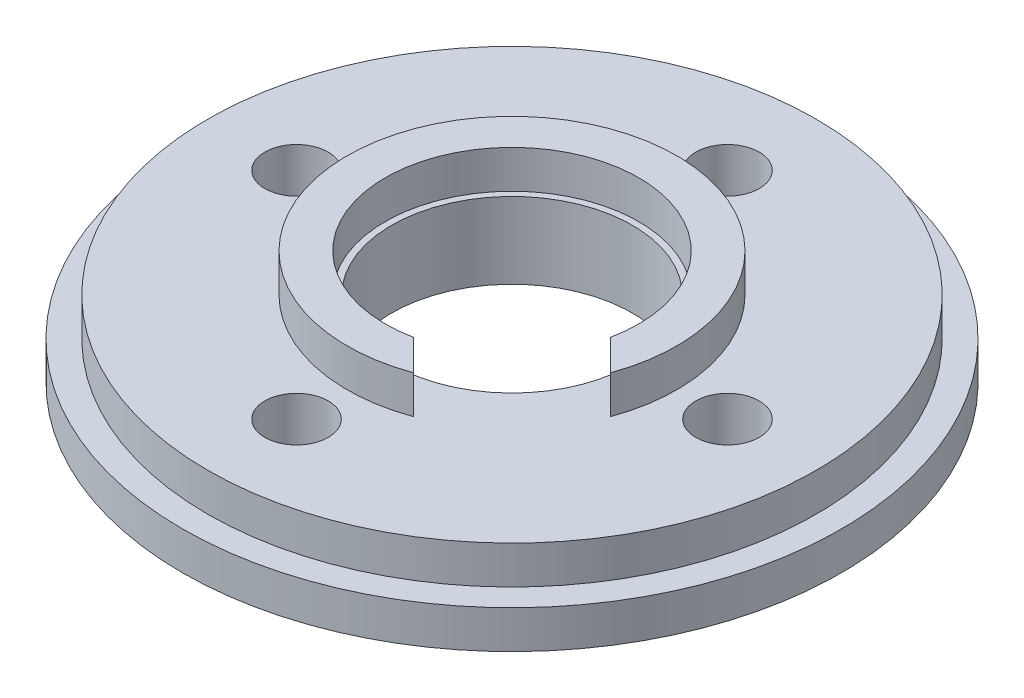
ISO-10303-21;
HEADER;
FILE_DESCRIPTION(('STEP AP214'),'2;1');
FILE_NAME('part.step','',(''),(''),'','','');
FILE_SCHEMA(('AUTOMOTIVE_DESIGN { 1 0 10303 214 1 1 1 1 }'));
ENDSEC;
DATA;
#1=APPLICATION_CONTEXT('core data for automotive mechanical design processes');
#2=APPLICATION_PROTOCOL_DEFINITION('international standard','automotive_design',2000,#1);
#3=PRODUCT_CONTEXT('',#1,'mechanical');
#4=PRODUCT('Part','Part','',(#3));
#5=PRODUCT_RELATED_PRODUCT_CATEGORY('part','',(#4));
#6=PRODUCT_DEFINITION_FORMATION('','',#4);
#7=PRODUCT_DEFINITION_CONTEXT('part definition',#1,'design');
#8=PRODUCT_DEFINITION('design','',#6,#7);
#9=PRODUCT_DEFINITION_SHAPE('','',#8);
#10=(LENGTH_UNIT() NAMED_UNIT(*) SI_UNIT(.MILLI.,.METRE.));
#11=(NAMED_UNIT(*) PLANE_ANGLE_UNIT() SI_UNIT($,.RADIAN.));
#12=(NAMED_UNIT(*) SI_UNIT($,.STERADIAN.) SOLID_ANGLE_UNIT());
#13=UNCERTAINTY_MEASURE_WITH_UNIT(LENGTH_MEASURE(1.E-05),#10,'distance_accuracy_value','');
#14=(GEOMETRIC_REPRESENTATION_CONTEXT(3) GLOBAL_UNCERTAINTY_ASSIGNED_CONTEXT((#13)) GLOBAL_UNIT_ASSIGNED_CONTEXT((#10,
#11,#12)) REPRESENTATION_CONTEXT('',''));
#15=CARTESIAN_POINT('',(0.,0.,0.));
#16=DIRECTION('',(0.,0.,1.));
#17=DIRECTION('',(1.,0.,0.));
#18=AXIS2_PLACEMENT_3D('',#15,#16,#17);
#19=CARTESIAN_POINT('',(0.,-7.,0.));
#20=DIRECTION('',(0.,1.,0.));
#21=DIRECTION('',(0.,0.,1.));
#22=AXIS2_PLACEMENT_3D('',#19,#20,#21);
#23=CYLINDRICAL_SURFACE('',#22,4.75);
#24=CARTESIAN_POINT('',(0.,0.,0.));
#25=DIRECTION('',(0.,1.,0.));
#26=DIRECTION('',(0.,0.,1.));
#27=AXIS2_PLACEMENT_3D('',#24,#25,#26);
#28=CIRCLE('',#27,4.75);
#29=CARTESIAN_POINT('',(0.,0.,4.75));
#30=VERTEX_POINT('',#29);
#31=EDGE_CURVE('E117',#30,#30,#28,.T.);
#32=ORIENTED_EDGE('',*,*,#31,.F.);
#33=EDGE_LOOP('',(#32));
#34=FACE_BOUND('',#33,.T.);
#35=CARTESIAN_POINT('',(0.,3.,0.));
#36=DIRECTION('',(0.,1.,0.));
#37=DIRECTION('',(0.,0.,1.));
#38=AXIS2_PLACEMENT_3D('',#35,#36,#37);
#39=CIRCLE('',#38,4.75);
#40=CARTESIAN_POINT('',(0.,3.,4.75));
#41=VERTEX_POINT('',#40);
#42=EDGE_CURVE('E112',#41,#41,#39,.F.);
#43=ORIENTED_EDGE('',*,*,#42,.F.);
#44=EDGE_LOOP('',(#43));
#45=FACE_BOUND('',#44,.T.);
#46=ADVANCED_FACE('F45',(#34,#45),#23,.F.);
#47=CARTESIAN_POINT('',(0.,1.5,0.));
#48=DIRECTION('',(0.,-1.,0.));
#49=DIRECTION('',(0.,0.,-1.));
#50=AXIS2_PLACEMENT_3D('',#47,#48,#49);
#51=CYLINDRICAL_SURFACE('',#50,13.);
#52=CARTESIAN_POINT('',(0.,1.5,0.));
#53=DIRECTION('',(0.,1.,0.));
#54=DIRECTION('',(0.,0.,1.));
#55=AXIS2_PLACEMENT_3D('',#52,#53,#54);
#56=CIRCLE('',#55,13.);
#57=CARTESIAN_POINT('',(0.,1.5,13.));
#58=VERTEX_POINT('',#57);
#59=EDGE_CURVE('E168',#58,#58,#56,.T.);
#60=ORIENTED_EDGE('',*,*,#59,.F.);
#61=EDGE_LOOP('',(#60));
#62=FACE_BOUND('',#61,.T.);
#63=CARTESIAN_POINT('',(0.,0.,0.));
#64=DIRECTION('',(0.,1.,0.));
#65=DIRECTION('',(0.,0.,1.));
#66=AXIS2_PLACEMENT_3D('',#63,#64,#65);
#67=CIRCLE('',#66,13.);
#68=CARTESIAN_POINT('',(0.,0.,13.));
#69=VERTEX_POINT('',#68);
#70=EDGE_CURVE('E164',#69,#69,#67,.T.);
#71=ORIENTED_EDGE('',*,*,#70,.T.);
#72=EDGE_LOOP('',(#71));
#73=FACE_BOUND('',#72,.T.);
#74=ADVANCED_FACE('F47',(#62,#73),#51,.T.);
#75=CARTESIAN_POINT('',(0.,1.5,0.));
#76=DIRECTION('',(0.,1.,0.));
#77=DIRECTION('',(0.,0.,1.));
#78=AXIS2_PLACEMENT_3D('',#75,#76,#77);
#79=PLANE('',#78);
#80=CARTESIAN_POINT('',(0.,1.5,0.));
#81=DIRECTION('',(0.,1.,0.));
#82=DIRECTION('',(0.,0.,1.));
#83=AXIS2_PLACEMENT_3D('',#80,#81,#82);
#84=CIRCLE('',#83,12.);
#85=CARTESIAN_POINT('',(0.,1.5,12.));
#86=VERTEX_POINT('',#85);
#87=EDGE_CURVE('E160',#86,#86,#84,.T.);
#88=ORIENTED_EDGE('',*,*,#87,.F.);
#89=EDGE_LOOP('',(#88));
#90=FACE_BOUND('',#89,.T.);
#91=ORIENTED_EDGE('',*,*,#59,.T.);
#92=EDGE_LOOP('',(#91));
#93=FACE_BOUND('',#92,.T.);
#94=ADVANCED_FACE('F188',(#90,#93),#79,.T.);
#95=CARTESIAN_POINT('',(0.,0.,0.));
#96=DIRECTION('',(0.,1.,0.));
#97=DIRECTION('',(0.,0.,1.));
#98=AXIS2_PLACEMENT_3D('',#95,#96,#97);
#99=PLANE('',#98);
#100=ORIENTED_EDGE('',*,*,#31,.T.);
#101=EDGE_LOOP('',(#100));
#102=FACE_BOUND('',#101,.T.);
#103=CARTESIAN_POINT('',(-8.5,0.,0.));
#104=DIRECTION('',(0.,1.,0.));
#105=DIRECTION('',(0.,0.,1.));
#106=AXIS2_PLACEMENT_3D('',#103,#104,#105);
#107=CIRCLE('',#106,1.25);
#108=CARTESIAN_POINT('',(-8.5,0.,1.25));
#109=VERTEX_POINT('',#108);
#110=EDGE_CURVE('E149',#109,#109,#107,.T.);
#111=ORIENTED_EDGE('',*,*,#110,.T.);
#112=EDGE_LOOP('',(#111));
#113=FACE_BOUND('',#112,.T.);
#114=CARTESIAN_POINT('',(0.,0.,-8.5));
#115=DIRECTION('',(0.,1.,0.));
#116=DIRECTION('',(0.,0.,1.));
#117=AXIS2_PLACEMENT_3D('',#114,#115,#116);
#118=CIRCLE('',#117,1.25);
#119=CARTESIAN_POINT('',(0.,0.,-7.25));
#120=VERTEX_POINT('',#119);
#121=EDGE_CURVE('E145',#120,#120,#118,.T.);
#122=ORIENTED_EDGE('',*,*,#121,.T.);
#123=EDGE_LOOP('',(#122));
#124=FACE_BOUND('',#123,.T.);
#125=CARTESIAN_POINT('',(8.5,0.,0.));
#126=DIRECTION('',(0.,1.,0.));
#127=DIRECTION('',(0.,0.,1.));
#128=AXIS2_PLACEMENT_3D('',#125,#126,#127);
#129=CIRCLE('',#128,1.25);
#130=CARTESIAN_POINT('',(8.5,0.,1.25000000000006));
#131=VERTEX_POINT('',#130);
#132=EDGE_CURVE('E141',#131,#131,#129,.T.);
#133=ORIENTED_EDGE('',*,*,#132,.T.);
#134=EDGE_LOOP('',(#133));
#135=FACE_BOUND('',#134,.T.);
#136=CARTESIAN_POINT('',(0.,0.,8.5));
#137=DIRECTION('',(0.,1.,0.));
#138=DIRECTION('',(0.,0.,1.));
#139=AXIS2_PLACEMENT_3D('',#136,#137,#138);
#140=CIRCLE('',#139,1.25);
#141=CARTESIAN_POINT('',(0.,0.,9.75));
#142=VERTEX_POINT('',#141);
#143=EDGE_CURVE('E126',#142,#142,#140,.T.);
#144=ORIENTED_EDGE('',*,*,#143,.T.);
#145=EDGE_LOOP('',(#144));
#146=FACE_BOUND('',#145,.T.);
#147=ORIENTED_EDGE('',*,*,#70,.F.);
#148=EDGE_LOOP('',(#147));
#149=FACE_BOUND('',#148,.T.);
#150=ADVANCED_FACE('F219',(#102,#113,#124,#135,#146,#149),#99,.F.);
#151=CARTESIAN_POINT('',(0.,3.,0.));
#152=DIRECTION('',(0.,-1.,0.));
#153=DIRECTION('',(0.,0.,-1.));
#154=AXIS2_PLACEMENT_3D('',#151,#152,#153);
#155=CYLINDRICAL_SURFACE('',#154,12.);
#156=CARTESIAN_POINT('',(0.,3.,0.));
#157=DIRECTION('',(0.,1.,0.));
#158=DIRECTION('',(0.,0.,1.));
#159=AXIS2_PLACEMENT_3D('',#156,#157,#158);
#160=CIRCLE('',#159,12.);
#161=CARTESIAN_POINT('',(0.,3.,12.));
#162=VERTEX_POINT('',#161);
#163=EDGE_CURVE('E155',#162,#162,#160,.T.);
#164=ORIENTED_EDGE('',*,*,#163,.F.);
#165=EDGE_LOOP('',(#164));
#166=FACE_BOUND('',#165,.T.);
#167=ORIENTED_EDGE('',*,*,#87,.T.);
#168=EDGE_LOOP('',(#167));
#169=FACE_BOUND('',#168,.T.);
#170=ADVANCED_FACE('F216',(#166,#169),#155,.T.);
#171=CARTESIAN_POINT('',(0.,3.,0.));
#172=DIRECTION('',(0.,1.,0.));
#173=DIRECTION('',(0.,0.,1.));
#174=AXIS2_PLACEMENT_3D('',#171,#172,#173);
#175=PLANE('',#174);
#176=CARTESIAN_POINT('',(0.,3.,0.));
#177=DIRECTION('',(0.,1.,0.));
#178=DIRECTION('',(0.,0.,1.));
#179=AXIS2_PLACEMENT_3D('',#176,#177,#178);
#180=CIRCLE('',#179,6.5);
#181=CARTESIAN_POINT('',(6.10912646050242,3.,2.22003916397643));
#182=VERTEX_POINT('',#181);
#183=CARTESIAN_POINT('',(2.2200391639764,3.,6.10912646050243));
#184=VERTEX_POINT('',#183);
#185=EDGE_CURVE('E156',#182,#184,#180,.T.);
#186=ORIENTED_EDGE('',*,*,#185,.F.);
#187=DIRECTION('',(-0.707106781186546,0.,-0.707106781186549));
#188=VECTOR('',#187,1.);
#189=CARTESIAN_POINT('',(4.65669407218421,3.,0.767606775658206));
#190=LINE('',#189,#188);
#191=CARTESIAN_POINT('',(4.89729660101743,3.,1.00820930449143));
#192=VERTEX_POINT('',#191);
#193=EDGE_CURVE('E61',#182,#192,#190,.T.);
#194=ORIENTED_EDGE('',*,*,#193,.T.);
#195=CARTESIAN_POINT('',(0.,3.,0.));
#196=DIRECTION('',(0.,1.,0.));
#197=DIRECTION('',(0.,0.,1.));
#198=AXIS2_PLACEMENT_3D('',#195,#196,#197);
#199=CIRCLE('',#198,5.);
#200=CARTESIAN_POINT('',(1.00820930449142,3.,4.89729660101744));
#201=VERTEX_POINT('',#200);
#202=EDGE_CURVE('E107',#192,#201,#199,.T.);
#203=ORIENTED_EDGE('',*,*,#202,.T.);
#204=DIRECTION('',(0.707106781186546,0.,0.707106781186549));
#205=VECTOR('',#204,1.);
#206=CARTESIAN_POINT('',(0.767606775658191,3.,4.65669407218421));
#207=LINE('',#206,#205);
#208=EDGE_CURVE('E89',#201,#184,#207,.T.);
#209=ORIENTED_EDGE('',*,*,#208,.T.);
#210=EDGE_LOOP('',(#186,#194,#203,#209));
#211=FACE_BOUND('',#210,.T.);
#212=CARTESIAN_POINT('',(-8.5,3.,0.));
#213=DIRECTION('',(0.,1.,0.));
#214=DIRECTION('',(0.,0.,1.));
#215=AXIS2_PLACEMENT_3D('',#212,#213,#214);
#216=CIRCLE('',#215,1.25);
#217=CARTESIAN_POINT('',(-8.5,3.,1.25));
#218=VERTEX_POINT('',#217);
#219=EDGE_CURVE('E122',#218,#218,#216,.T.);
#220=ORIENTED_EDGE('',*,*,#219,.F.);
#221=EDGE_LOOP('',(#220));
#222=FACE_BOUND('',#221,.T.);
#223=CARTESIAN_POINT('',(0.,3.,-8.5));
#224=DIRECTION('',(0.,1.,0.));
#225=DIRECTION('',(0.,0.,1.));
#226=AXIS2_PLACEMENT_3D('',#223,#224,#225);
#227=CIRCLE('',#226,1.25);
#228=CARTESIAN_POINT('',(0.,3.,-7.25));
#229=VERTEX_POINT('',#228);
#230=EDGE_CURVE('E127',#229,#229,#227,.T.);
#231=ORIENTED_EDGE('',*,*,#230,.F.);
#232=EDGE_LOOP('',(#231));
#233=FACE_BOUND('',#232,.T.);
#234=CARTESIAN_POINT('',(8.5,3.,0.));
#235=DIRECTION('',(0.,1.,0.));
#236=DIRECTION('',(0.,0.,1.));
#237=AXIS2_PLACEMENT_3D('',#234,#235,#236);
#238=CIRCLE('',#237,1.25);
#239=CARTESIAN_POINT('',(8.5,3.,1.25000000000006));
#240=VERTEX_POINT('',#239);
#241=EDGE_CURVE('E131',#240,#240,#238,.T.);
#242=ORIENTED_EDGE('',*,*,#241,.F.);
#243=EDGE_LOOP('',(#242));
#244=FACE_BOUND('',#243,.T.);
#245=CARTESIAN_POINT('',(0.,3.,8.5));
#246=DIRECTION('',(0.,1.,0.));
#247=DIRECTION('',(0.,0.,1.));
#248=AXIS2_PLACEMENT_3D('',#245,#246,#247);
#249=CIRCLE('',#248,1.25);
#250=CARTESIAN_POINT('',(0.,3.,9.75));
#251=VERTEX_POINT('',#250);
#252=EDGE_CURVE('E121',#251,#251,#249,.T.);
#253=ORIENTED_EDGE('',*,*,#252,.F.);
#254=EDGE_LOOP('',(#253));
#255=FACE_BOUND('',#254,.T.);
#256=ORIENTED_EDGE('',*,*,#163,.T.);
#257=EDGE_LOOP('',(#256));
#258=FACE_BOUND('',#257,.T.);
#259=ORIENTED_EDGE('',*,*,#42,.T.);
#260=EDGE_LOOP('',(#259));
#261=FACE_BOUND('',#260,.T.);
#262=ADVANCED_FACE('F180',(#211,#222,#233,#244,#255,#258,#261),#175,.T.);
#263=CARTESIAN_POINT('',(0.,4.5,0.));
#264=DIRECTION('',(0.,-1.,0.));
#265=DIRECTION('',(0.,0.,-1.));
#266=AXIS2_PLACEMENT_3D('',#263,#264,#265);
#267=CYLINDRICAL_SURFACE('',#266,6.5);
#268=ORIENTED_EDGE('',*,*,#185,.T.);
#269=DIRECTION('',(0.,-1.,0.));
#270=VECTOR('',#269,1.);
#271=CARTESIAN_POINT('',(2.2200391639764,4.5,6.10912646050243));
#272=LINE('',#271,#270);
#273=CARTESIAN_POINT('',(2.22003916397641,4.5,6.10912646050243));
#274=VERTEX_POINT('',#273);
#275=EDGE_CURVE('E108',#184,#274,#272,.F.);
#276=ORIENTED_EDGE('',*,*,#275,.T.);
#277=CARTESIAN_POINT('',(0.,4.5,0.));
#278=DIRECTION('',(0.,1.,0.));
#279=DIRECTION('',(0.,0.,1.));
#280=AXIS2_PLACEMENT_3D('',#277,#278,#279);
#281=CIRCLE('',#280,6.5);
#282=CARTESIAN_POINT('',(6.10912646050242,4.5,2.22003916397642));
#283=VERTEX_POINT('',#282);
#284=EDGE_CURVE('E100',#283,#274,#281,.T.);
#285=ORIENTED_EDGE('',*,*,#284,.F.);
#286=DIRECTION('',(0.,-1.,0.));
#287=VECTOR('',#286,1.);
#288=CARTESIAN_POINT('',(6.10912646050242,4.5,2.22003916397643));
#289=LINE('',#288,#287);
#290=EDGE_CURVE('E114',#283,#182,#289,.T.);
#291=ORIENTED_EDGE('',*,*,#290,.T.);
#292=EDGE_LOOP('',(#268,#276,#285,#291));
#293=FACE_BOUND('',#292,.T.);
#294=ADVANCED_FACE('F212',(#293),#267,.T.);
#295=CARTESIAN_POINT('',(0.,4.5,0.));
#296=DIRECTION('',(0.,1.,0.));
#297=DIRECTION('',(0.,0.,1.));
#298=AXIS2_PLACEMENT_3D('',#295,#296,#297);
#299=PLANE('',#298);
#300=DIRECTION('',(0.707106781186546,0.,0.707106781186549));
#301=VECTOR('',#300,1.);
#302=CARTESIAN_POINT('',(0.767606775658191,4.5,4.65669407218421));
#303=LINE('',#302,#301);
#304=CARTESIAN_POINT('',(1.00820930449142,4.5,4.89729660101744));
#305=VERTEX_POINT('',#304);
#306=EDGE_CURVE('E86',#305,#274,#303,.T.);
#307=ORIENTED_EDGE('',*,*,#306,.F.);
#308=CARTESIAN_POINT('',(0.,4.5,0.));
#309=DIRECTION('',(0.,1.,0.));
#310=DIRECTION('',(0.,0.,1.));
#311=AXIS2_PLACEMENT_3D('',#308,#309,#310);
#312=CIRCLE('',#311,5.);
#313=CARTESIAN_POINT('',(4.89729660101743,4.5,1.00820930449143));
#314=VERTEX_POINT('',#313);
#315=EDGE_CURVE('E98',#314,#305,#312,.T.);
#316=ORIENTED_EDGE('',*,*,#315,.F.);
#317=DIRECTION('',(-0.707106781186546,0.,-0.707106781186549));
#318=VECTOR('',#317,1.);
#319=CARTESIAN_POINT('',(4.65669407218421,4.5,0.767606775658206));
#320=LINE('',#319,#318);
#321=EDGE_CURVE('E102',#283,#314,#320,.T.);
#322=ORIENTED_EDGE('',*,*,#321,.F.);
#323=ORIENTED_EDGE('',*,*,#284,.T.);
#324=EDGE_LOOP('',(#307,#316,#322,#323));
#325=FACE_BOUND('',#324,.T.);
#326=ADVANCED_FACE('F96',(#325),#299,.T.);
#327=CARTESIAN_POINT('',(0.,-8.5,8.5));
#328=DIRECTION('',(0.,1.,0.));
#329=DIRECTION('',(0.,0.,1.));
#330=AXIS2_PLACEMENT_3D('',#327,#328,#329);
#331=CYLINDRICAL_SURFACE('',#330,1.25);
#332=ORIENTED_EDGE('',*,*,#252,.T.);
#333=EDGE_LOOP('',(#332));
#334=FACE_BOUND('',#333,.T.);
#335=ORIENTED_EDGE('',*,*,#143,.F.);
#336=EDGE_LOOP('',(#335));
#337=FACE_BOUND('',#336,.T.);
#338=ADVANCED_FACE('F205',(#334,#337),#331,.F.);
#339=CARTESIAN_POINT('',(8.5,-8.5,0.));
#340=DIRECTION('',(0.,1.,0.));
#341=DIRECTION('',(0.,0.,1.));
#342=AXIS2_PLACEMENT_3D('',#339,#340,#341);
#343=CYLINDRICAL_SURFACE('',#342,1.25);
#344=ORIENTED_EDGE('',*,*,#241,.T.);
#345=EDGE_LOOP('',(#344));
#346=FACE_BOUND('',#345,.T.);
#347=ORIENTED_EDGE('',*,*,#132,.F.);
#348=EDGE_LOOP('',(#347));
#349=FACE_BOUND('',#348,.T.);
#350=ADVANCED_FACE('F201',(#346,#349),#343,.F.);
#351=CARTESIAN_POINT('',(0.,-8.5,-8.5));
#352=DIRECTION('',(0.,1.,0.));
#353=DIRECTION('',(0.,0.,1.));
#354=AXIS2_PLACEMENT_3D('',#351,#352,#353);
#355=CYLINDRICAL_SURFACE('',#354,1.25);
#356=ORIENTED_EDGE('',*,*,#230,.T.);
#357=EDGE_LOOP('',(#356));
#358=FACE_BOUND('',#357,.T.);
#359=ORIENTED_EDGE('',*,*,#121,.F.);
#360=EDGE_LOOP('',(#359));
#361=FACE_BOUND('',#360,.T.);
#362=ADVANCED_FACE('F197',(#358,#361),#355,.F.);
#363=CARTESIAN_POINT('',(-8.5,-8.5,0.));
#364=DIRECTION('',(0.,1.,0.));
#365=DIRECTION('',(0.,0.,1.));
#366=AXIS2_PLACEMENT_3D('',#363,#364,#365);
#367=CYLINDRICAL_SURFACE('',#366,1.25);
#368=ORIENTED_EDGE('',*,*,#219,.T.);
#369=EDGE_LOOP('',(#368));
#370=FACE_BOUND('',#369,.T.);
#371=ORIENTED_EDGE('',*,*,#110,.F.);
#372=EDGE_LOOP('',(#371));
#373=FACE_BOUND('',#372,.T.);
#374=ADVANCED_FACE('F194',(#370,#373),#367,.F.);
#375=CARTESIAN_POINT('',(0.,3.,0.));
#376=DIRECTION('',(0.,1.,0.));
#377=DIRECTION('',(0.,0.,1.));
#378=AXIS2_PLACEMENT_3D('',#375,#376,#377);
#379=CYLINDRICAL_SURFACE('',#378,5.);
#380=ORIENTED_EDGE('',*,*,#315,.T.);
#381=DIRECTION('',(0.,1.,0.));
#382=VECTOR('',#381,1.);
#383=CARTESIAN_POINT('',(1.00820930449142,3.,4.89729660101744));
#384=LINE('',#383,#382);
#385=EDGE_CURVE('E11',#305,#201,#384,.F.);
#386=ORIENTED_EDGE('',*,*,#385,.T.);
#387=ORIENTED_EDGE('',*,*,#202,.F.);
#388=DIRECTION('',(0.,1.,0.));
#389=VECTOR('',#388,1.);
#390=CARTESIAN_POINT('',(4.89729660101743,3.,1.00820930449143));
#391=LINE('',#390,#389);
#392=EDGE_CURVE('E54',#192,#314,#391,.T.);
#393=ORIENTED_EDGE('',*,*,#392,.T.);
#394=EDGE_LOOP('',(#380,#386,#387,#393));
#395=FACE_BOUND('',#394,.T.);
#396=ADVANCED_FACE('F105',(#395),#379,.F.);
#397=CARTESIAN_POINT('',(0.767606775658191,3.,4.65669407218421));
#398=DIRECTION('',(-0.707106781186549,0.,0.707106781186546));
#399=DIRECTION('',(0.707106781186546,0.,0.707106781186549));
#400=AXIS2_PLACEMENT_3D('',#397,#398,#399);
#401=PLANE('',#400);
#402=ORIENTED_EDGE('',*,*,#208,.F.);
#403=ORIENTED_EDGE('',*,*,#385,.F.);
#404=ORIENTED_EDGE('',*,*,#306,.T.);
#405=ORIENTED_EDGE('',*,*,#275,.F.);
#406=EDGE_LOOP('',(#402,#403,#404,#405));
#407=FACE_BOUND('',#406,.T.);
#408=ADVANCED_FACE('F85',(#407),#401,.F.);
#409=CARTESIAN_POINT('',(4.65669407218421,3.,0.767606775658206));
#410=DIRECTION('',(0.707106781186549,0.,-0.707106781186546));
#411=DIRECTION('',(-0.707106781186546,0.,-0.707106781186549));
#412=AXIS2_PLACEMENT_3D('',#409,#410,#411);
#413=PLANE('',#412);
#414=ORIENTED_EDGE('',*,*,#321,.T.);
#415=ORIENTED_EDGE('',*,*,#392,.F.);
#416=ORIENTED_EDGE('',*,*,#193,.F.);
#417=ORIENTED_EDGE('',*,*,#290,.F.);
#418=EDGE_LOOP('',(#414,#415,#416,#417));
#419=FACE_BOUND('',#418,.T.);
#420=ADVANCED_FACE('F288',(#419),#413,.F.);
#421=CLOSED_SHELL('',(#46,#74,#94,#150,#170,#262,#294,#326,#338,#350,#362,#374,#396,#408,#420));
#422=MANIFOLD_SOLID_BREP('B2',#421);
#423=ADVANCED_BREP_SHAPE_REPRESENTATION('',(#18,#422),#14);
#424=SHAPE_DEFINITION_REPRESENTATION(#9,#423);
ENDSEC;
END-ISO-10303-21;
